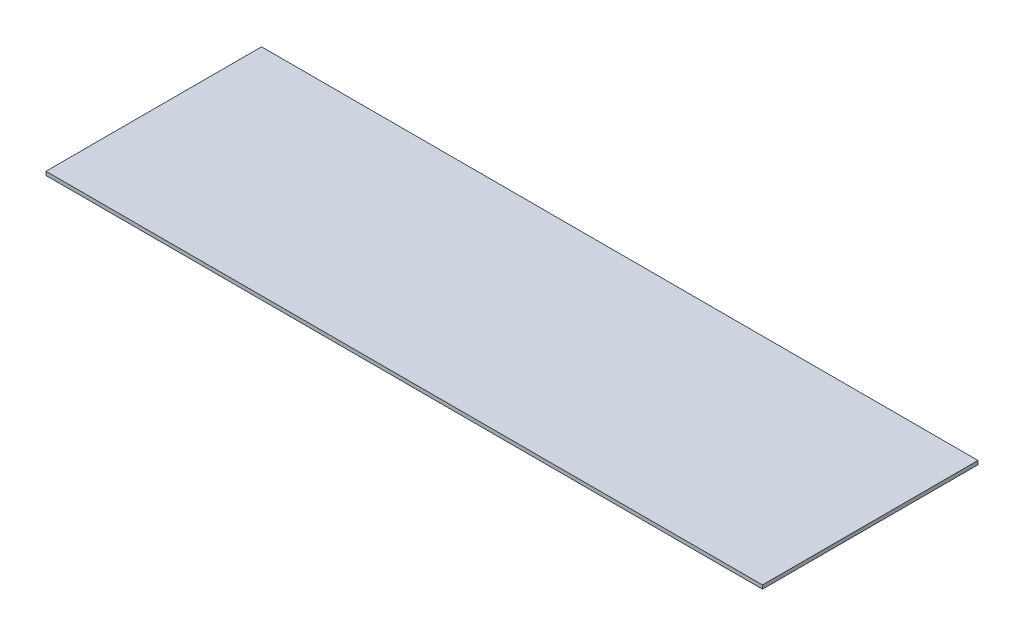
ISO-10303-21;
HEADER;
FILE_DESCRIPTION(('STEP AP214'),'2;1');
FILE_NAME('part.step','',(''),(''),'','','');
FILE_SCHEMA(('AUTOMOTIVE_DESIGN { 1 0 10303 214 1 1 1 1 }'));
ENDSEC;
DATA;
#1=APPLICATION_CONTEXT('core data for automotive mechanical design processes');
#2=APPLICATION_PROTOCOL_DEFINITION('international standard','automotive_design',2000,#1);
#3=PRODUCT_CONTEXT('',#1,'mechanical');
#4=PRODUCT('Part','Part','',(#3));
#5=PRODUCT_RELATED_PRODUCT_CATEGORY('part','',(#4));
#6=PRODUCT_DEFINITION_FORMATION('','',#4);
#7=PRODUCT_DEFINITION_CONTEXT('part definition',#1,'design');
#8=PRODUCT_DEFINITION('design','',#6,#7);
#9=PRODUCT_DEFINITION_SHAPE('','',#8);
#10=(LENGTH_UNIT() NAMED_UNIT(*) SI_UNIT(.MILLI.,.METRE.));
#11=(NAMED_UNIT(*) PLANE_ANGLE_UNIT() SI_UNIT($,.RADIAN.));
#12=(NAMED_UNIT(*) SI_UNIT($,.STERADIAN.) SOLID_ANGLE_UNIT());
#13=UNCERTAINTY_MEASURE_WITH_UNIT(LENGTH_MEASURE(1.E-05),#10,'distance_accuracy_value','');
#14=(GEOMETRIC_REPRESENTATION_CONTEXT(3) GLOBAL_UNCERTAINTY_ASSIGNED_CONTEXT((#13)) GLOBAL_UNIT_ASSIGNED_CONTEXT((#10,
#11,#12)) REPRESENTATION_CONTEXT('',''));
#15=CARTESIAN_POINT('',(0.,0.,0.));
#16=DIRECTION('',(0.,0.,1.));
#17=DIRECTION('',(1.,0.,0.));
#18=AXIS2_PLACEMENT_3D('',#15,#16,#17);
#19=CARTESIAN_POINT('',(0.,6.35,0.));
#20=DIRECTION('',(1.,0.,0.));
#21=DIRECTION('',(0.,0.,-1.));
#22=AXIS2_PLACEMENT_3D('',#19,#20,#21);
#23=PLANE('',#22);
#24=DIRECTION('',(0.,0.,1.));
#25=VECTOR('',#24,1.);
#26=CARTESIAN_POINT('',(0.,0.,0.));
#27=LINE('',#26,#25);
#28=CARTESIAN_POINT('',(0.,0.,-366.776));
#29=VERTEX_POINT('',#28);
#30=CARTESIAN_POINT('',(0.,0.,0.));
#31=VERTEX_POINT('',#30);
#32=EDGE_CURVE('E98',#29,#31,#27,.T.);
#33=ORIENTED_EDGE('',*,*,#32,.T.);
#34=DIRECTION('',(0.,-1.,0.));
#35=VECTOR('',#34,1.);
#36=CARTESIAN_POINT('',(0.,6.35,0.));
#37=LINE('',#36,#35);
#38=CARTESIAN_POINT('',(0.,6.35,0.));
#39=VERTEX_POINT('',#38);
#40=EDGE_CURVE('E11',#39,#31,#37,.T.);
#41=ORIENTED_EDGE('',*,*,#40,.F.);
#42=DIRECTION('',(0.,0.,1.));
#43=VECTOR('',#42,1.);
#44=CARTESIAN_POINT('',(0.,6.35,0.));
#45=LINE('',#44,#43);
#46=CARTESIAN_POINT('',(0.,6.35,-366.776));
#47=VERTEX_POINT('',#46);
#48=EDGE_CURVE('E86',#47,#39,#45,.T.);
#49=ORIENTED_EDGE('',*,*,#48,.F.);
#50=DIRECTION('',(0.,-1.,0.));
#51=VECTOR('',#50,1.);
#52=CARTESIAN_POINT('',(0.,6.35,-366.776));
#53=LINE('',#52,#51);
#54=EDGE_CURVE('E94',#47,#29,#53,.T.);
#55=ORIENTED_EDGE('',*,*,#54,.T.);
#56=EDGE_LOOP('',(#33,#41,#49,#55));
#57=FACE_BOUND('',#56,.T.);
#58=ADVANCED_FACE('F35',(#57),#23,.F.);
#59=CARTESIAN_POINT('',(0.,6.35,0.));
#60=DIRECTION('',(0.,0.,-1.));
#61=DIRECTION('',(-1.,0.,0.));
#62=AXIS2_PLACEMENT_3D('',#59,#60,#61);
#63=PLANE('',#62);
#64=DIRECTION('',(1.,0.,0.));
#65=VECTOR('',#64,1.);
#66=CARTESIAN_POINT('',(0.,0.,0.));
#67=LINE('',#66,#65);
#68=CARTESIAN_POINT('',(1219.2,0.,0.));
#69=VERTEX_POINT('',#68);
#70=EDGE_CURVE('E90',#31,#69,#67,.T.);
#71=ORIENTED_EDGE('',*,*,#70,.T.);
#72=DIRECTION('',(0.,-1.,0.));
#73=VECTOR('',#72,1.);
#74=CARTESIAN_POINT('',(1219.2,6.35,0.));
#75=LINE('',#74,#73);
#76=CARTESIAN_POINT('',(1219.2,6.35,0.));
#77=VERTEX_POINT('',#76);
#78=EDGE_CURVE('E43',#77,#69,#75,.T.);
#79=ORIENTED_EDGE('',*,*,#78,.F.);
#80=DIRECTION('',(1.,0.,0.));
#81=VECTOR('',#80,1.);
#82=CARTESIAN_POINT('',(0.,6.35,0.));
#83=LINE('',#82,#81);
#84=EDGE_CURVE('E81',#39,#77,#83,.T.);
#85=ORIENTED_EDGE('',*,*,#84,.F.);
#86=ORIENTED_EDGE('',*,*,#40,.T.);
#87=EDGE_LOOP('',(#71,#79,#85,#86));
#88=FACE_BOUND('',#87,.T.);
#89=ADVANCED_FACE('F89',(#88),#63,.F.);
#90=CARTESIAN_POINT('',(1219.2,6.35,0.));
#91=DIRECTION('',(-1.,0.,0.));
#92=DIRECTION('',(0.,0.,1.));
#93=AXIS2_PLACEMENT_3D('',#90,#91,#92);
#94=PLANE('',#93);
#95=DIRECTION('',(0.,0.,-1.));
#96=VECTOR('',#95,1.);
#97=CARTESIAN_POINT('',(1219.2,0.,0.));
#98=LINE('',#97,#96);
#99=CARTESIAN_POINT('',(1219.2,0.,-366.776));
#100=VERTEX_POINT('',#99);
#101=EDGE_CURVE('E68',#69,#100,#98,.T.);
#102=ORIENTED_EDGE('',*,*,#101,.T.);
#103=DIRECTION('',(0.,-1.,0.));
#104=VECTOR('',#103,1.);
#105=CARTESIAN_POINT('',(1219.2,6.35,-366.776));
#106=LINE('',#105,#104);
#107=CARTESIAN_POINT('',(1219.2,6.35,-366.776));
#108=VERTEX_POINT('',#107);
#109=EDGE_CURVE('E91',#108,#100,#106,.T.);
#110=ORIENTED_EDGE('',*,*,#109,.F.);
#111=DIRECTION('',(0.,0.,-1.));
#112=VECTOR('',#111,1.);
#113=CARTESIAN_POINT('',(1219.2,6.35,0.));
#114=LINE('',#113,#112);
#115=EDGE_CURVE('E84',#77,#108,#114,.T.);
#116=ORIENTED_EDGE('',*,*,#115,.F.);
#117=ORIENTED_EDGE('',*,*,#78,.T.);
#118=EDGE_LOOP('',(#102,#110,#116,#117));
#119=FACE_BOUND('',#118,.T.);
#120=ADVANCED_FACE('F92',(#119),#94,.F.);
#121=CARTESIAN_POINT('',(0.,6.35,-366.776));
#122=DIRECTION('',(0.,0.,1.));
#123=DIRECTION('',(1.,0.,0.));
#124=AXIS2_PLACEMENT_3D('',#121,#122,#123);
#125=PLANE('',#124);
#126=DIRECTION('',(-1.,0.,0.));
#127=VECTOR('',#126,1.);
#128=CARTESIAN_POINT('',(0.,0.,-366.776));
#129=LINE('',#128,#127);
#130=EDGE_CURVE('E74',#100,#29,#129,.T.);
#131=ORIENTED_EDGE('',*,*,#130,.T.);
#132=ORIENTED_EDGE('',*,*,#54,.F.);
#133=DIRECTION('',(-1.,0.,0.));
#134=VECTOR('',#133,1.);
#135=CARTESIAN_POINT('',(0.,6.35,-366.776));
#136=LINE('',#135,#134);
#137=EDGE_CURVE('E51',#108,#47,#136,.T.);
#138=ORIENTED_EDGE('',*,*,#137,.F.);
#139=ORIENTED_EDGE('',*,*,#109,.T.);
#140=EDGE_LOOP('',(#131,#132,#138,#139));
#141=FACE_BOUND('',#140,.T.);
#142=ADVANCED_FACE('F105',(#141),#125,.F.);
#143=CARTESIAN_POINT('',(0.,6.35,0.));
#144=DIRECTION('',(0.,-1.,0.));
#145=DIRECTION('',(0.,0.,-1.));
#146=AXIS2_PLACEMENT_3D('',#143,#144,#145);
#147=PLANE('',#146);
#148=ORIENTED_EDGE('',*,*,#48,.T.);
#149=ORIENTED_EDGE('',*,*,#84,.T.);
#150=ORIENTED_EDGE('',*,*,#115,.T.);
#151=ORIENTED_EDGE('',*,*,#137,.T.);
#152=EDGE_LOOP('',(#148,#149,#150,#151));
#153=FACE_BOUND('',#152,.T.);
#154=ADVANCED_FACE('F82',(#153),#147,.F.);
#155=CARTESIAN_POINT('',(0.,0.,0.));
#156=DIRECTION('',(0.,-1.,0.));
#157=DIRECTION('',(0.,0.,-1.));
#158=AXIS2_PLACEMENT_3D('',#155,#156,#157);
#159=PLANE('',#158);
#160=ORIENTED_EDGE('',*,*,#32,.F.);
#161=ORIENTED_EDGE('',*,*,#130,.F.);
#162=ORIENTED_EDGE('',*,*,#101,.F.);
#163=ORIENTED_EDGE('',*,*,#70,.F.);
#164=EDGE_LOOP('',(#160,#161,#162,#163));
#165=FACE_BOUND('',#164,.T.);
#166=ADVANCED_FACE('F108',(#165),#159,.T.);
#167=CLOSED_SHELL('',(#58,#89,#120,#142,#154,#166));
#168=MANIFOLD_SOLID_BREP('B2',#167);
#169=ADVANCED_BREP_SHAPE_REPRESENTATION('',(#18,#168),#14);
#170=SHAPE_DEFINITION_REPRESENTATION(#9,#169);
ENDSEC;
END-ISO-10303-21;
